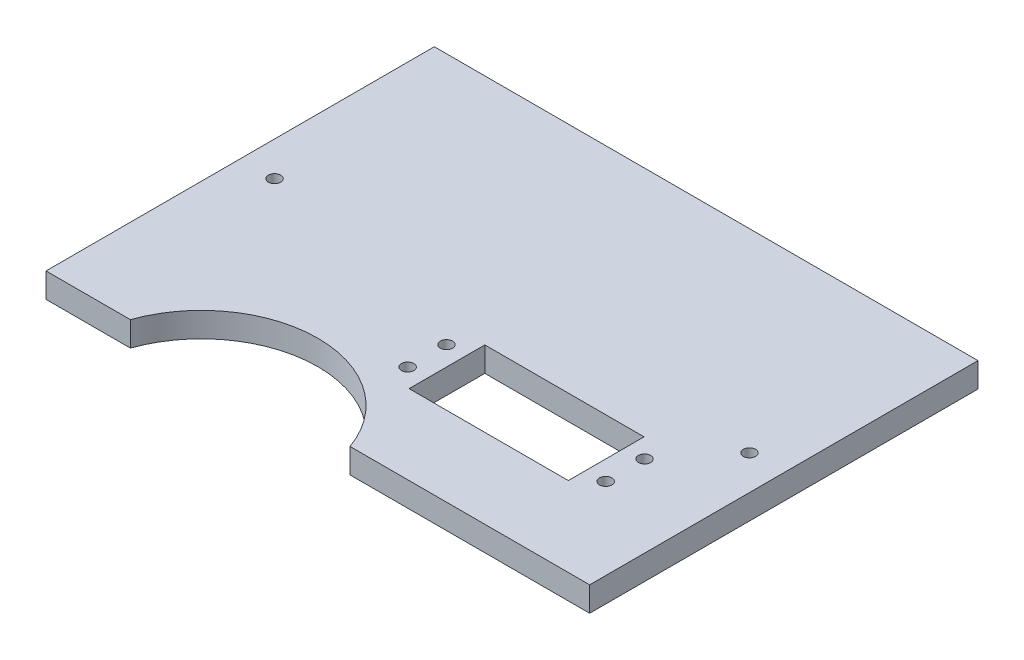
ISO-10303-21;
HEADER;
FILE_DESCRIPTION(('STEP AP214'),'2;1');
FILE_NAME('part.step','',(''),(''),'','','');
FILE_SCHEMA(('AUTOMOTIVE_DESIGN { 1 0 10303 214 1 1 1 1 }'));
ENDSEC;
DATA;
#1=APPLICATION_CONTEXT('core data for automotive mechanical design processes');
#2=APPLICATION_PROTOCOL_DEFINITION('international standard','automotive_design',2000,#1);
#3=PRODUCT_CONTEXT('',#1,'mechanical');
#4=PRODUCT('Part','Part','',(#3));
#5=PRODUCT_RELATED_PRODUCT_CATEGORY('part','',(#4));
#6=PRODUCT_DEFINITION_FORMATION('','',#4);
#7=PRODUCT_DEFINITION_CONTEXT('part definition',#1,'design');
#8=PRODUCT_DEFINITION('design','',#6,#7);
#9=PRODUCT_DEFINITION_SHAPE('','',#8);
#10=(LENGTH_UNIT() NAMED_UNIT(*) SI_UNIT(.MILLI.,.METRE.));
#11=(NAMED_UNIT(*) PLANE_ANGLE_UNIT() SI_UNIT($,.RADIAN.));
#12=(NAMED_UNIT(*) SI_UNIT($,.STERADIAN.) SOLID_ANGLE_UNIT());
#13=UNCERTAINTY_MEASURE_WITH_UNIT(LENGTH_MEASURE(1.E-05),#10,'distance_accuracy_value','');
#14=(GEOMETRIC_REPRESENTATION_CONTEXT(3) GLOBAL_UNCERTAINTY_ASSIGNED_CONTEXT((#13)) GLOBAL_UNIT_ASSIGNED_CONTEXT((#10,
#11,#12)) REPRESENTATION_CONTEXT('',''));
#15=CARTESIAN_POINT('',(0.,0.,0.));
#16=DIRECTION('',(0.,0.,1.));
#17=DIRECTION('',(1.,0.,0.));
#18=AXIS2_PLACEMENT_3D('',#15,#16,#17);
#19=CARTESIAN_POINT('',(0.,6.35,0.));
#20=DIRECTION('',(0.,0.,-1.));
#21=DIRECTION('',(-1.,0.,0.));
#22=AXIS2_PLACEMENT_3D('',#19,#20,#21);
#23=PLANE('',#22);
#24=DIRECTION('',(1.,0.,0.));
#25=VECTOR('',#24,1.);
#26=CARTESIAN_POINT('',(0.,0.,0.));
#27=LINE('',#26,#25);
#28=CARTESIAN_POINT('',(0.,0.,0.));
#29=VERTEX_POINT('',#28);
#30=CARTESIAN_POINT('',(21.7157287525381,0.,0.));
#31=VERTEX_POINT('',#30);
#32=EDGE_CURVE('E146',#29,#31,#27,.T.);
#33=ORIENTED_EDGE('',*,*,#32,.T.);
#34=DIRECTION('',(0.,1.,0.));
#35=VECTOR('',#34,1.);
#36=CARTESIAN_POINT('',(21.7157287525381,-3.65,0.));
#37=LINE('',#36,#35);
#38=CARTESIAN_POINT('',(21.7157287525381,6.35,0.));
#39=VERTEX_POINT('',#38);
#40=EDGE_CURVE('E49',#31,#39,#37,.T.);
#41=ORIENTED_EDGE('',*,*,#40,.T.);
#42=DIRECTION('',(1.,0.,0.));
#43=VECTOR('',#42,1.);
#44=CARTESIAN_POINT('',(0.,6.35,0.));
#45=LINE('',#44,#43);
#46=CARTESIAN_POINT('',(0.,6.35,0.));
#47=VERTEX_POINT('',#46);
#48=EDGE_CURVE('E124',#47,#39,#45,.T.);
#49=ORIENTED_EDGE('',*,*,#48,.F.);
#50=DIRECTION('',(0.,-1.,0.));
#51=VECTOR('',#50,1.);
#52=CARTESIAN_POINT('',(0.,6.35,0.));
#53=LINE('',#52,#51);
#54=EDGE_CURVE('E158',#47,#29,#53,.T.);
#55=ORIENTED_EDGE('',*,*,#54,.T.);
#56=EDGE_LOOP('',(#33,#41,#49,#55));
#57=FACE_BOUND('',#56,.T.);
#58=ADVANCED_FACE('F33',(#57),#23,.F.);
#59=CARTESIAN_POINT('',(0.,6.35,0.));
#60=DIRECTION('',(1.,0.,0.));
#61=DIRECTION('',(0.,0.,-1.));
#62=AXIS2_PLACEMENT_3D('',#59,#60,#61);
#63=PLANE('',#62);
#64=DIRECTION('',(0.,0.,1.));
#65=VECTOR('',#64,1.);
#66=CARTESIAN_POINT('',(0.,0.,0.));
#67=LINE('',#66,#65);
#68=CARTESIAN_POINT('',(0.,0.,-100.));
#69=VERTEX_POINT('',#68);
#70=EDGE_CURVE('E141',#69,#29,#67,.T.);
#71=ORIENTED_EDGE('',*,*,#70,.T.);
#72=ORIENTED_EDGE('',*,*,#54,.F.);
#73=DIRECTION('',(0.,0.,1.));
#74=VECTOR('',#73,1.);
#75=CARTESIAN_POINT('',(0.,6.35,0.));
#76=LINE('',#75,#74);
#77=CARTESIAN_POINT('',(0.,6.35,-100.));
#78=VERTEX_POINT('',#77);
#79=EDGE_CURVE('E130',#78,#47,#76,.T.);
#80=ORIENTED_EDGE('',*,*,#79,.F.);
#81=DIRECTION('',(0.,-1.,0.));
#82=VECTOR('',#81,1.);
#83=CARTESIAN_POINT('',(0.,6.35,-100.));
#84=LINE('',#83,#82);
#85=EDGE_CURVE('E140',#78,#69,#84,.T.);
#86=ORIENTED_EDGE('',*,*,#85,.T.);
#87=EDGE_LOOP('',(#71,#72,#80,#86));
#88=FACE_BOUND('',#87,.T.);
#89=ADVANCED_FACE('F35',(#88),#63,.F.);
#90=CARTESIAN_POINT('',(78.2842712474619,6.35,0.));
#91=VERTEX_POINT('',#90);
#92=CARTESIAN_POINT('',(140.,6.35,0.));
#93=VERTEX_POINT('',#92);
#94=EDGE_CURVE('E121',#91,#93,#45,.T.);
#95=ORIENTED_EDGE('',*,*,#94,.F.);
#96=DIRECTION('',(0.,1.,0.));
#97=VECTOR('',#96,1.);
#98=CARTESIAN_POINT('',(78.2842712474619,-3.65,0.));
#99=LINE('',#98,#97);
#100=CARTESIAN_POINT('',(78.2842712474619,0.,0.));
#101=VERTEX_POINT('',#100);
#102=EDGE_CURVE('E110',#91,#101,#99,.F.);
#103=ORIENTED_EDGE('',*,*,#102,.T.);
#104=CARTESIAN_POINT('',(140.,0.,0.));
#105=VERTEX_POINT('',#104);
#106=EDGE_CURVE('E144',#101,#105,#27,.T.);
#107=ORIENTED_EDGE('',*,*,#106,.T.);
#108=DIRECTION('',(0.,-1.,0.));
#109=VECTOR('',#108,1.);
#110=CARTESIAN_POINT('',(140.,6.35,0.));
#111=LINE('',#110,#109);
#112=EDGE_CURVE('E128',#93,#105,#111,.T.);
#113=ORIENTED_EDGE('',*,*,#112,.F.);
#114=EDGE_LOOP('',(#95,#103,#107,#113));
#115=FACE_BOUND('',#114,.T.);
#116=ADVANCED_FACE('F126',(#115),#23,.F.);
#117=CARTESIAN_POINT('',(140.,6.35,0.));
#118=DIRECTION('',(-1.,0.,0.));
#119=DIRECTION('',(0.,0.,1.));
#120=AXIS2_PLACEMENT_3D('',#117,#118,#119);
#121=PLANE('',#120);
#122=DIRECTION('',(0.,0.,-1.));
#123=VECTOR('',#122,1.);
#124=CARTESIAN_POINT('',(140.,0.,0.));
#125=LINE('',#124,#123);
#126=CARTESIAN_POINT('',(140.,0.,-100.));
#127=VERTEX_POINT('',#126);
#128=EDGE_CURVE('E149',#105,#127,#125,.T.);
#129=ORIENTED_EDGE('',*,*,#128,.T.);
#130=DIRECTION('',(0.,-1.,0.));
#131=VECTOR('',#130,1.);
#132=CARTESIAN_POINT('',(140.,6.35,-100.));
#133=LINE('',#132,#131);
#134=CARTESIAN_POINT('',(140.,6.35,-100.));
#135=VERTEX_POINT('',#134);
#136=EDGE_CURVE('E154',#135,#127,#133,.T.);
#137=ORIENTED_EDGE('',*,*,#136,.F.);
#138=DIRECTION('',(0.,0.,-1.));
#139=VECTOR('',#138,1.);
#140=CARTESIAN_POINT('',(140.,6.35,0.));
#141=LINE('',#140,#139);
#142=EDGE_CURVE('E132',#93,#135,#141,.T.);
#143=ORIENTED_EDGE('',*,*,#142,.F.);
#144=ORIENTED_EDGE('',*,*,#112,.T.);
#145=EDGE_LOOP('',(#129,#137,#143,#144));
#146=FACE_BOUND('',#145,.T.);
#147=ADVANCED_FACE('F287',(#146),#121,.F.);
#148=CARTESIAN_POINT('',(0.,6.35,-100.));
#149=DIRECTION('',(0.,0.,1.));
#150=DIRECTION('',(1.,0.,0.));
#151=AXIS2_PLACEMENT_3D('',#148,#149,#150);
#152=PLANE('',#151);
#153=DIRECTION('',(-1.,0.,0.));
#154=VECTOR('',#153,1.);
#155=CARTESIAN_POINT('',(0.,0.,-100.));
#156=LINE('',#155,#154);
#157=EDGE_CURVE('E133',#127,#69,#156,.T.);
#158=ORIENTED_EDGE('',*,*,#157,.T.);
#159=ORIENTED_EDGE('',*,*,#85,.F.);
#160=DIRECTION('',(-1.,0.,0.));
#161=VECTOR('',#160,1.);
#162=CARTESIAN_POINT('',(0.,6.35,-100.));
#163=LINE('',#162,#161);
#164=EDGE_CURVE('E138',#135,#78,#163,.T.);
#165=ORIENTED_EDGE('',*,*,#164,.F.);
#166=ORIENTED_EDGE('',*,*,#136,.T.);
#167=EDGE_LOOP('',(#158,#159,#165,#166));
#168=FACE_BOUND('',#167,.T.);
#169=ADVANCED_FACE('F257',(#168),#152,.F.);
#170=CARTESIAN_POINT('',(0.,6.35,0.));
#171=DIRECTION('',(0.,-1.,0.));
#172=DIRECTION('',(0.,0.,-1.));
#173=AXIS2_PLACEMENT_3D('',#170,#171,#172);
#174=PLANE('',#173);
#175=CARTESIAN_POINT('',(131.15,6.35,-50.));
#176=DIRECTION('',(0.,1.,0.));
#177=DIRECTION('',(0.,0.,1.));
#178=AXIS2_PLACEMENT_3D('',#175,#176,#177);
#179=CIRCLE('',#178,1.58749999999999);
#180=CARTESIAN_POINT('',(131.15,6.35,-48.4125));
#181=VERTEX_POINT('',#180);
#182=EDGE_CURVE('E173',#181,#181,#179,.T.);
#183=ORIENTED_EDGE('',*,*,#182,.F.);
#184=EDGE_LOOP('',(#183));
#185=FACE_BOUND('',#184,.T.);
#186=CARTESIAN_POINT('',(119.,6.35,-25.125));
#187=DIRECTION('',(0.,1.,0.));
#188=DIRECTION('',(0.,0.,1.));
#189=AXIS2_PLACEMENT_3D('',#186,#187,#188);
#190=CIRCLE('',#189,1.5875);
#191=CARTESIAN_POINT('',(119.,6.35,-23.5375));
#192=VERTEX_POINT('',#191);
#193=EDGE_CURVE('E247',#192,#192,#190,.T.);
#194=ORIENTED_EDGE('',*,*,#193,.F.);
#195=EDGE_LOOP('',(#194));
#196=FACE_BOUND('',#195,.T.);
#197=CARTESIAN_POINT('',(8.85,6.35,-50.));
#198=DIRECTION('',(0.,1.,0.));
#199=DIRECTION('',(0.,0.,1.));
#200=AXIS2_PLACEMENT_3D('',#197,#198,#199);
#201=CIRCLE('',#200,1.5875);
#202=CARTESIAN_POINT('',(8.85,6.35,-48.4125));
#203=VERTEX_POINT('',#202);
#204=EDGE_CURVE('E240',#203,#203,#201,.T.);
#205=ORIENTED_EDGE('',*,*,#204,.F.);
#206=EDGE_LOOP('',(#205));
#207=FACE_BOUND('',#206,.T.);
#208=CARTESIAN_POINT('',(68.,6.35,-25.125));
#209=DIRECTION('',(0.,1.,0.));
#210=DIRECTION('',(0.,0.,1.));
#211=AXIS2_PLACEMENT_3D('',#208,#209,#210);
#212=CIRCLE('',#211,1.5875);
#213=CARTESIAN_POINT('',(68.,6.35,-23.5375));
#214=VERTEX_POINT('',#213);
#215=EDGE_CURVE('E237',#214,#214,#212,.T.);
#216=ORIENTED_EDGE('',*,*,#215,.F.);
#217=EDGE_LOOP('',(#216));
#218=FACE_BOUND('',#217,.T.);
#219=CARTESIAN_POINT('',(119.,6.35,-35.125));
#220=DIRECTION('',(0.,1.,0.));
#221=DIRECTION('',(0.,0.,1.));
#222=AXIS2_PLACEMENT_3D('',#219,#220,#221);
#223=CIRCLE('',#222,1.58749999999999);
#224=CARTESIAN_POINT('',(119.,6.35,-33.5375));
#225=VERTEX_POINT('',#224);
#226=EDGE_CURVE('E241',#225,#225,#223,.T.);
#227=ORIENTED_EDGE('',*,*,#226,.F.);
#228=EDGE_LOOP('',(#227));
#229=FACE_BOUND('',#228,.T.);
#230=CARTESIAN_POINT('',(68.,6.35,-35.125));
#231=DIRECTION('',(0.,1.,0.));
#232=DIRECTION('',(0.,0.,1.));
#233=AXIS2_PLACEMENT_3D('',#230,#231,#232);
#234=CIRCLE('',#233,1.58749999999998);
#235=CARTESIAN_POINT('',(68.,6.35,-33.5375));
#236=VERTEX_POINT('',#235);
#237=EDGE_CURVE('E244',#236,#236,#234,.T.);
#238=ORIENTED_EDGE('',*,*,#237,.F.);
#239=EDGE_LOOP('',(#238));
#240=FACE_BOUND('',#239,.T.);
#241=DIRECTION('',(1.,0.,0.));
#242=VECTOR('',#241,1.);
#243=CARTESIAN_POINT('',(73.,6.35,-20.5));
#244=LINE('',#243,#242);
#245=CARTESIAN_POINT('',(73.,6.35,-20.5));
#246=VERTEX_POINT('',#245);
#247=CARTESIAN_POINT('',(114.,6.35,-20.5));
#248=VERTEX_POINT('',#247);
#249=EDGE_CURVE('E230',#246,#248,#244,.T.);
#250=ORIENTED_EDGE('',*,*,#249,.F.);
#251=DIRECTION('',(0.,0.,1.));
#252=VECTOR('',#251,1.);
#253=CARTESIAN_POINT('',(73.,6.35,-40.));
#254=LINE('',#253,#252);
#255=CARTESIAN_POINT('',(73.,6.35,-40.));
#256=VERTEX_POINT('',#255);
#257=EDGE_CURVE('E57',#256,#246,#254,.T.);
#258=ORIENTED_EDGE('',*,*,#257,.F.);
#259=DIRECTION('',(-1.,0.,0.));
#260=VECTOR('',#259,1.);
#261=CARTESIAN_POINT('',(73.,6.35,-40.));
#262=LINE('',#261,#260);
#263=CARTESIAN_POINT('',(114.,6.35,-40.));
#264=VERTEX_POINT('',#263);
#265=EDGE_CURVE('E217',#264,#256,#262,.T.);
#266=ORIENTED_EDGE('',*,*,#265,.F.);
#267=DIRECTION('',(0.,0.,-1.));
#268=VECTOR('',#267,1.);
#269=CARTESIAN_POINT('',(114.,6.35,-40.));
#270=LINE('',#269,#268);
#271=EDGE_CURVE('E228',#248,#264,#270,.T.);
#272=ORIENTED_EDGE('',*,*,#271,.F.);
#273=EDGE_LOOP('',(#250,#258,#266,#272));
#274=FACE_BOUND('',#273,.T.);
#275=ORIENTED_EDGE('',*,*,#48,.T.);
#276=CARTESIAN_POINT('',(50.,6.35,9.99999999999999));
#277=DIRECTION('',(0.,1.,0.));
#278=DIRECTION('',(0.,0.,1.));
#279=AXIS2_PLACEMENT_3D('',#276,#277,#278);
#280=CIRCLE('',#279,30.);
#281=EDGE_CURVE('E113',#91,#39,#280,.T.);
#282=ORIENTED_EDGE('',*,*,#281,.F.);
#283=ORIENTED_EDGE('',*,*,#94,.T.);
#284=ORIENTED_EDGE('',*,*,#142,.T.);
#285=ORIENTED_EDGE('',*,*,#164,.T.);
#286=ORIENTED_EDGE('',*,*,#79,.T.);
#287=EDGE_LOOP('',(#275,#282,#283,#284,#285,#286));
#288=FACE_BOUND('',#287,.T.);
#289=ADVANCED_FACE('F120',(#185,#196,#207,#218,#229,#240,#274,#288),#174,.F.);
#290=CARTESIAN_POINT('',(0.,0.,0.));
#291=DIRECTION('',(0.,-1.,0.));
#292=DIRECTION('',(0.,0.,-1.));
#293=AXIS2_PLACEMENT_3D('',#290,#291,#292);
#294=PLANE('',#293);
#295=CARTESIAN_POINT('',(131.15,0.,-50.));
#296=DIRECTION('',(0.,-1.,0.));
#297=DIRECTION('',(0.,0.,-1.));
#298=AXIS2_PLACEMENT_3D('',#295,#296,#297);
#299=CIRCLE('',#298,1.58749999999999);
#300=CARTESIAN_POINT('',(131.15,0.,-51.5875));
#301=VERTEX_POINT('',#300);
#302=EDGE_CURVE('E37',#301,#301,#299,.T.);
#303=ORIENTED_EDGE('',*,*,#302,.F.);
#304=EDGE_LOOP('',(#303));
#305=FACE_BOUND('',#304,.T.);
#306=CARTESIAN_POINT('',(119.,0.,-25.125));
#307=DIRECTION('',(0.,-1.,0.));
#308=DIRECTION('',(0.,0.,-1.));
#309=AXIS2_PLACEMENT_3D('',#306,#307,#308);
#310=CIRCLE('',#309,1.5875);
#311=CARTESIAN_POINT('',(119.,0.,-26.7125));
#312=VERTEX_POINT('',#311);
#313=EDGE_CURVE('E181',#312,#312,#310,.T.);
#314=ORIENTED_EDGE('',*,*,#313,.F.);
#315=EDGE_LOOP('',(#314));
#316=FACE_BOUND('',#315,.T.);
#317=CARTESIAN_POINT('',(8.85,0.,-50.));
#318=DIRECTION('',(0.,-1.,0.));
#319=DIRECTION('',(0.,0.,-1.));
#320=AXIS2_PLACEMENT_3D('',#317,#318,#319);
#321=CIRCLE('',#320,1.5875);
#322=CARTESIAN_POINT('',(8.85,0.,-51.5875));
#323=VERTEX_POINT('',#322);
#324=EDGE_CURVE('E179',#323,#323,#321,.T.);
#325=ORIENTED_EDGE('',*,*,#324,.F.);
#326=EDGE_LOOP('',(#325));
#327=FACE_BOUND('',#326,.T.);
#328=CARTESIAN_POINT('',(68.,0.,-25.125));
#329=DIRECTION('',(0.,-1.,0.));
#330=DIRECTION('',(0.,0.,-1.));
#331=AXIS2_PLACEMENT_3D('',#328,#329,#330);
#332=CIRCLE('',#331,1.5875);
#333=CARTESIAN_POINT('',(68.,0.,-26.7125));
#334=VERTEX_POINT('',#333);
#335=EDGE_CURVE('E176',#334,#334,#332,.T.);
#336=ORIENTED_EDGE('',*,*,#335,.F.);
#337=EDGE_LOOP('',(#336));
#338=FACE_BOUND('',#337,.T.);
#339=CARTESIAN_POINT('',(119.,0.,-35.125));
#340=DIRECTION('',(0.,-1.,0.));
#341=DIRECTION('',(0.,0.,-1.));
#342=AXIS2_PLACEMENT_3D('',#339,#340,#341);
#343=CIRCLE('',#342,1.58749999999999);
#344=CARTESIAN_POINT('',(119.,0.,-36.7125));
#345=VERTEX_POINT('',#344);
#346=EDGE_CURVE('E172',#345,#345,#343,.T.);
#347=ORIENTED_EDGE('',*,*,#346,.F.);
#348=EDGE_LOOP('',(#347));
#349=FACE_BOUND('',#348,.T.);
#350=CARTESIAN_POINT('',(68.,0.,-35.125));
#351=DIRECTION('',(0.,-1.,0.));
#352=DIRECTION('',(0.,0.,-1.));
#353=AXIS2_PLACEMENT_3D('',#350,#351,#352);
#354=CIRCLE('',#353,1.58749999999998);
#355=CARTESIAN_POINT('',(68.,0.,-36.7125));
#356=VERTEX_POINT('',#355);
#357=EDGE_CURVE('E169',#356,#356,#354,.T.);
#358=ORIENTED_EDGE('',*,*,#357,.F.);
#359=EDGE_LOOP('',(#358));
#360=FACE_BOUND('',#359,.T.);
#361=CARTESIAN_POINT('',(50.,0.,9.99999999999999));
#362=DIRECTION('',(0.,-1.,0.));
#363=DIRECTION('',(0.,0.,-1.));
#364=AXIS2_PLACEMENT_3D('',#361,#362,#363);
#365=CIRCLE('',#364,30.);
#366=EDGE_CURVE('E11',#31,#101,#365,.T.);
#367=ORIENTED_EDGE('',*,*,#366,.F.);
#368=ORIENTED_EDGE('',*,*,#32,.F.);
#369=ORIENTED_EDGE('',*,*,#70,.F.);
#370=ORIENTED_EDGE('',*,*,#157,.F.);
#371=ORIENTED_EDGE('',*,*,#128,.F.);
#372=ORIENTED_EDGE('',*,*,#106,.F.);
#373=EDGE_LOOP('',(#367,#368,#369,#370,#371,#372));
#374=FACE_BOUND('',#373,.T.);
#375=DIRECTION('',(0.,0.,-1.));
#376=VECTOR('',#375,1.);
#377=CARTESIAN_POINT('',(73.,0.,0.));
#378=LINE('',#377,#376);
#379=CARTESIAN_POINT('',(73.,0.,-20.5));
#380=VERTEX_POINT('',#379);
#381=CARTESIAN_POINT('',(73.,0.,-40.));
#382=VERTEX_POINT('',#381);
#383=EDGE_CURVE('E42',#380,#382,#378,.T.);
#384=ORIENTED_EDGE('',*,*,#383,.F.);
#385=DIRECTION('',(-1.,0.,0.));
#386=VECTOR('',#385,1.);
#387=CARTESIAN_POINT('',(0.,0.,-20.5));
#388=LINE('',#387,#386);
#389=CARTESIAN_POINT('',(114.,0.,-20.5));
#390=VERTEX_POINT('',#389);
#391=EDGE_CURVE('E161',#390,#380,#388,.T.);
#392=ORIENTED_EDGE('',*,*,#391,.F.);
#393=DIRECTION('',(0.,0.,1.));
#394=VECTOR('',#393,1.);
#395=CARTESIAN_POINT('',(114.,0.,0.));
#396=LINE('',#395,#394);
#397=CARTESIAN_POINT('',(114.,0.,-40.));
#398=VERTEX_POINT('',#397);
#399=EDGE_CURVE('E163',#398,#390,#396,.T.);
#400=ORIENTED_EDGE('',*,*,#399,.F.);
#401=DIRECTION('',(1.,0.,0.));
#402=VECTOR('',#401,1.);
#403=CARTESIAN_POINT('',(0.,0.,-40.));
#404=LINE('',#403,#402);
#405=EDGE_CURVE('E166',#382,#398,#404,.T.);
#406=ORIENTED_EDGE('',*,*,#405,.F.);
#407=EDGE_LOOP('',(#384,#392,#400,#406));
#408=FACE_BOUND('',#407,.T.);
#409=ADVANCED_FACE('F191',(#305,#316,#327,#338,#349,#360,#374,#408),#294,.T.);
#410=CARTESIAN_POINT('',(73.,-3.65,-40.));
#411=DIRECTION('',(-1.,0.,0.));
#412=DIRECTION('',(0.,0.,1.));
#413=AXIS2_PLACEMENT_3D('',#410,#411,#412);
#414=PLANE('',#413);
#415=ORIENTED_EDGE('',*,*,#383,.T.);
#416=DIRECTION('',(0.,1.,0.));
#417=VECTOR('',#416,1.);
#418=CARTESIAN_POINT('',(73.,-3.65,-40.));
#419=LINE('',#418,#417);
#420=EDGE_CURVE('E145',#382,#256,#419,.T.);
#421=ORIENTED_EDGE('',*,*,#420,.T.);
#422=ORIENTED_EDGE('',*,*,#257,.T.);
#423=DIRECTION('',(0.,1.,0.));
#424=VECTOR('',#423,1.);
#425=CARTESIAN_POINT('',(73.,-3.65,-20.5));
#426=LINE('',#425,#424);
#427=EDGE_CURVE('E212',#380,#246,#426,.T.);
#428=ORIENTED_EDGE('',*,*,#427,.F.);
#429=EDGE_LOOP('',(#415,#421,#422,#428));
#430=FACE_BOUND('',#429,.T.);
#431=ADVANCED_FACE('F194',(#430),#414,.F.);
#432=CARTESIAN_POINT('',(73.,-3.65,-40.));
#433=DIRECTION('',(0.,0.,-1.));
#434=DIRECTION('',(-1.,0.,0.));
#435=AXIS2_PLACEMENT_3D('',#432,#433,#434);
#436=PLANE('',#435);
#437=ORIENTED_EDGE('',*,*,#405,.T.);
#438=DIRECTION('',(0.,1.,0.));
#439=VECTOR('',#438,1.);
#440=CARTESIAN_POINT('',(114.,-3.65,-40.));
#441=LINE('',#440,#439);
#442=EDGE_CURVE('E218',#398,#264,#441,.T.);
#443=ORIENTED_EDGE('',*,*,#442,.T.);
#444=ORIENTED_EDGE('',*,*,#265,.T.);
#445=ORIENTED_EDGE('',*,*,#420,.F.);
#446=EDGE_LOOP('',(#437,#443,#444,#445));
#447=FACE_BOUND('',#446,.T.);
#448=ADVANCED_FACE('F214',(#447),#436,.F.);
#449=CARTESIAN_POINT('',(114.,-3.65,-40.));
#450=DIRECTION('',(1.,0.,0.));
#451=DIRECTION('',(0.,0.,-1.));
#452=AXIS2_PLACEMENT_3D('',#449,#450,#451);
#453=PLANE('',#452);
#454=ORIENTED_EDGE('',*,*,#399,.T.);
#455=DIRECTION('',(0.,1.,0.));
#456=VECTOR('',#455,1.);
#457=CARTESIAN_POINT('',(114.,-3.65,-20.5));
#458=LINE('',#457,#456);
#459=EDGE_CURVE('E220',#390,#248,#458,.T.);
#460=ORIENTED_EDGE('',*,*,#459,.T.);
#461=ORIENTED_EDGE('',*,*,#271,.T.);
#462=ORIENTED_EDGE('',*,*,#442,.F.);
#463=EDGE_LOOP('',(#454,#460,#461,#462));
#464=FACE_BOUND('',#463,.T.);
#465=ADVANCED_FACE('F270',(#464),#453,.F.);
#466=CARTESIAN_POINT('',(73.,-3.65,-20.5));
#467=DIRECTION('',(0.,0.,1.));
#468=DIRECTION('',(1.,0.,0.));
#469=AXIS2_PLACEMENT_3D('',#466,#467,#468);
#470=PLANE('',#469);
#471=ORIENTED_EDGE('',*,*,#391,.T.);
#472=ORIENTED_EDGE('',*,*,#427,.T.);
#473=ORIENTED_EDGE('',*,*,#249,.T.);
#474=ORIENTED_EDGE('',*,*,#459,.F.);
#475=EDGE_LOOP('',(#471,#472,#473,#474));
#476=FACE_BOUND('',#475,.T.);
#477=ADVANCED_FACE('F269',(#476),#470,.F.);
#478=CARTESIAN_POINT('',(50.,-3.65,9.99999999999999));
#479=DIRECTION('',(0.,1.,0.));
#480=DIRECTION('',(0.,0.,1.));
#481=AXIS2_PLACEMENT_3D('',#478,#479,#480);
#482=CYLINDRICAL_SURFACE('',#481,30.);
#483=ORIENTED_EDGE('',*,*,#366,.T.);
#484=ORIENTED_EDGE('',*,*,#102,.F.);
#485=ORIENTED_EDGE('',*,*,#281,.T.);
#486=ORIENTED_EDGE('',*,*,#40,.F.);
#487=EDGE_LOOP('',(#483,#484,#485,#486));
#488=FACE_BOUND('',#487,.T.);
#489=ADVANCED_FACE('F112',(#488),#482,.F.);
#490=CARTESIAN_POINT('',(68.,-3.65,-35.125));
#491=DIRECTION('',(0.,1.,0.));
#492=DIRECTION('',(0.,0.,1.));
#493=AXIS2_PLACEMENT_3D('',#490,#491,#492);
#494=CYLINDRICAL_SURFACE('',#493,1.58749999999998);
#495=ORIENTED_EDGE('',*,*,#357,.T.);
#496=EDGE_LOOP('',(#495));
#497=FACE_BOUND('',#496,.T.);
#498=ORIENTED_EDGE('',*,*,#237,.T.);
#499=EDGE_LOOP('',(#498));
#500=FACE_BOUND('',#499,.T.);
#501=ADVANCED_FACE('F337',(#497,#500),#494,.F.);
#502=CARTESIAN_POINT('',(119.,-3.65,-35.125));
#503=DIRECTION('',(0.,1.,0.));
#504=DIRECTION('',(0.,0.,1.));
#505=AXIS2_PLACEMENT_3D('',#502,#503,#504);
#506=CYLINDRICAL_SURFACE('',#505,1.58749999999999);
#507=ORIENTED_EDGE('',*,*,#346,.T.);
#508=EDGE_LOOP('',(#507));
#509=FACE_BOUND('',#508,.T.);
#510=ORIENTED_EDGE('',*,*,#226,.T.);
#511=EDGE_LOOP('',(#510));
#512=FACE_BOUND('',#511,.T.);
#513=ADVANCED_FACE('F357',(#509,#512),#506,.F.);
#514=CARTESIAN_POINT('',(68.,-3.65,-25.125));
#515=DIRECTION('',(0.,1.,0.));
#516=DIRECTION('',(0.,0.,1.));
#517=AXIS2_PLACEMENT_3D('',#514,#515,#516);
#518=CYLINDRICAL_SURFACE('',#517,1.5875);
#519=ORIENTED_EDGE('',*,*,#335,.T.);
#520=EDGE_LOOP('',(#519));
#521=FACE_BOUND('',#520,.T.);
#522=ORIENTED_EDGE('',*,*,#215,.T.);
#523=EDGE_LOOP('',(#522));
#524=FACE_BOUND('',#523,.T.);
#525=ADVANCED_FACE('F367',(#521,#524),#518,.F.);
#526=CARTESIAN_POINT('',(8.85,-3.65,-50.));
#527=DIRECTION('',(0.,1.,0.));
#528=DIRECTION('',(0.,0.,1.));
#529=AXIS2_PLACEMENT_3D('',#526,#527,#528);
#530=CYLINDRICAL_SURFACE('',#529,1.5875);
#531=ORIENTED_EDGE('',*,*,#324,.T.);
#532=EDGE_LOOP('',(#531));
#533=FACE_BOUND('',#532,.T.);
#534=ORIENTED_EDGE('',*,*,#204,.T.);
#535=EDGE_LOOP('',(#534));
#536=FACE_BOUND('',#535,.T.);
#537=ADVANCED_FACE('F377',(#533,#536),#530,.F.);
#538=CARTESIAN_POINT('',(119.,-3.65,-25.125));
#539=DIRECTION('',(0.,1.,0.));
#540=DIRECTION('',(0.,0.,1.));
#541=AXIS2_PLACEMENT_3D('',#538,#539,#540);
#542=CYLINDRICAL_SURFACE('',#541,1.5875);
#543=ORIENTED_EDGE('',*,*,#313,.T.);
#544=EDGE_LOOP('',(#543));
#545=FACE_BOUND('',#544,.T.);
#546=ORIENTED_EDGE('',*,*,#193,.T.);
#547=EDGE_LOOP('',(#546));
#548=FACE_BOUND('',#547,.T.);
#549=ADVANCED_FACE('F387',(#545,#548),#542,.F.);
#550=CARTESIAN_POINT('',(131.15,-3.65,-50.));
#551=DIRECTION('',(0.,1.,0.));
#552=DIRECTION('',(0.,0.,1.));
#553=AXIS2_PLACEMENT_3D('',#550,#551,#552);
#554=CYLINDRICAL_SURFACE('',#553,1.58749999999999);
#555=ORIENTED_EDGE('',*,*,#302,.T.);
#556=EDGE_LOOP('',(#555));
#557=FACE_BOUND('',#556,.T.);
#558=ORIENTED_EDGE('',*,*,#182,.T.);
#559=EDGE_LOOP('',(#558));
#560=FACE_BOUND('',#559,.T.);
#561=ADVANCED_FACE('F188',(#557,#560),#554,.F.);
#562=CLOSED_SHELL('',(#58,#89,#116,#147,#169,#289,#409,#431,#448,#465,#477,#489,#501,#513,#525,
#537,#549,#561));
#563=MANIFOLD_SOLID_BREP('B2',#562);
#564=ADVANCED_BREP_SHAPE_REPRESENTATION('',(#18,#563),#14);
#565=SHAPE_DEFINITION_REPRESENTATION(#9,#564);
ENDSEC;
END-ISO-10303-21;
